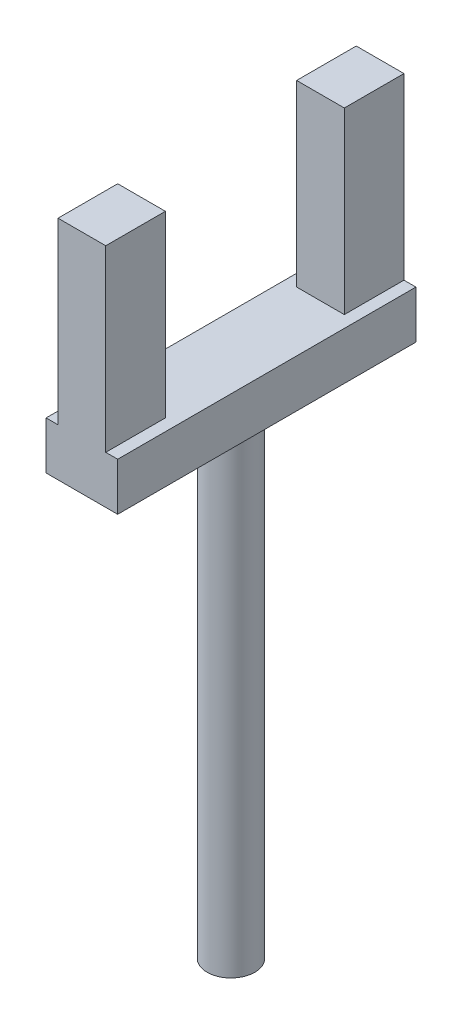
ISO-10303-21;
HEADER;
FILE_DESCRIPTION(('STEP AP214'),'2;1');
FILE_NAME('part.step','',(''),(''),'','','');
FILE_SCHEMA(('AUTOMOTIVE_DESIGN { 1 0 10303 214 1 1 1 1 }'));
ENDSEC;
DATA;
#1=APPLICATION_CONTEXT('core data for automotive mechanical design processes');
#2=APPLICATION_PROTOCOL_DEFINITION('international standard','automotive_design',2000,#1);
#3=PRODUCT_CONTEXT('',#1,'mechanical');
#4=PRODUCT('Part','Part','',(#3));
#5=PRODUCT_RELATED_PRODUCT_CATEGORY('part','',(#4));
#6=PRODUCT_DEFINITION_FORMATION('','',#4);
#7=PRODUCT_DEFINITION_CONTEXT('part definition',#1,'design');
#8=PRODUCT_DEFINITION('design','',#6,#7);
#9=PRODUCT_DEFINITION_SHAPE('','',#8);
#10=(LENGTH_UNIT() NAMED_UNIT(*) SI_UNIT(.MILLI.,.METRE.));
#11=(NAMED_UNIT(*) PLANE_ANGLE_UNIT() SI_UNIT($,.RADIAN.));
#12=(NAMED_UNIT(*) SI_UNIT($,.STERADIAN.) SOLID_ANGLE_UNIT());
#13=UNCERTAINTY_MEASURE_WITH_UNIT(LENGTH_MEASURE(1.E-05),#10,'distance_accuracy_value','');
#14=(GEOMETRIC_REPRESENTATION_CONTEXT(3) GLOBAL_UNCERTAINTY_ASSIGNED_CONTEXT((#13)) GLOBAL_UNIT_ASSIGNED_CONTEXT((#10,
#11,#12)) REPRESENTATION_CONTEXT('',''));
#15=CARTESIAN_POINT('',(0.,0.,0.));
#16=DIRECTION('',(0.,0.,1.));
#17=DIRECTION('',(1.,0.,0.));
#18=AXIS2_PLACEMENT_3D('',#15,#16,#17);
#19=CARTESIAN_POINT('',(-15.,220.,62.5));
#20=DIRECTION('',(0.,1.,0.));
#21=DIRECTION('',(0.,0.,1.));
#22=AXIS2_PLACEMENT_3D('',#19,#20,#21);
#23=PLANE('',#22);
#24=DIRECTION('',(1.,0.,0.));
#25=VECTOR('',#24,1.);
#26=CARTESIAN_POINT('',(-10.,220.,-37.5));
#27=LINE('',#26,#25);
#28=CARTESIAN_POINT('',(-10.,220.,-37.5));
#29=VERTEX_POINT('',#28);
#30=CARTESIAN_POINT('',(10.,220.,-37.5));
#31=VERTEX_POINT('',#30);
#32=EDGE_CURVE('E52',#29,#31,#27,.T.);
#33=ORIENTED_EDGE('',*,*,#32,.F.);
#34=DIRECTION('',(0.,0.,-1.));
#35=VECTOR('',#34,1.);
#36=CARTESIAN_POINT('',(-10.,220.,-62.5));
#37=LINE('',#36,#35);
#38=CARTESIAN_POINT('',(-10.,220.,-62.5));
#39=VERTEX_POINT('',#38);
#40=EDGE_CURVE('E142',#29,#39,#37,.T.);
#41=ORIENTED_EDGE('',*,*,#40,.T.);
#42=DIRECTION('',(1.,0.,0.));
#43=VECTOR('',#42,1.);
#44=CARTESIAN_POINT('',(-15.,220.,-62.5));
#45=LINE('',#44,#43);
#46=CARTESIAN_POINT('',(-15.,220.,-62.5));
#47=VERTEX_POINT('',#46);
#48=EDGE_CURVE('E219',#47,#39,#45,.T.);
#49=ORIENTED_EDGE('',*,*,#48,.F.);
#50=DIRECTION('',(0.,0.,1.));
#51=VECTOR('',#50,1.);
#52=CARTESIAN_POINT('',(-15.,220.,62.5));
#53=LINE('',#52,#51);
#54=CARTESIAN_POINT('',(-15.,220.,62.5));
#55=VERTEX_POINT('',#54);
#56=EDGE_CURVE('E201',#47,#55,#53,.T.);
#57=ORIENTED_EDGE('',*,*,#56,.T.);
#58=DIRECTION('',(1.,0.,0.));
#59=VECTOR('',#58,1.);
#60=CARTESIAN_POINT('',(-15.,220.,62.5));
#61=LINE('',#60,#59);
#62=CARTESIAN_POINT('',(-10.,220.,62.5));
#63=VERTEX_POINT('',#62);
#64=EDGE_CURVE('E215',#55,#63,#61,.T.);
#65=ORIENTED_EDGE('',*,*,#64,.T.);
#66=DIRECTION('',(0.,0.,-1.));
#67=VECTOR('',#66,1.);
#68=CARTESIAN_POINT('',(-10.,220.,62.5));
#69=LINE('',#68,#67);
#70=CARTESIAN_POINT('',(-10.,220.,37.5));
#71=VERTEX_POINT('',#70);
#72=EDGE_CURVE('E170',#63,#71,#69,.T.);
#73=ORIENTED_EDGE('',*,*,#72,.T.);
#74=DIRECTION('',(1.,0.,0.));
#75=VECTOR('',#74,1.);
#76=CARTESIAN_POINT('',(-10.,220.,37.5));
#77=LINE('',#76,#75);
#78=CARTESIAN_POINT('',(10.,220.,37.5));
#79=VERTEX_POINT('',#78);
#80=EDGE_CURVE('E179',#71,#79,#77,.T.);
#81=ORIENTED_EDGE('',*,*,#80,.T.);
#82=DIRECTION('',(0.,0.,-1.));
#83=VECTOR('',#82,1.);
#84=CARTESIAN_POINT('',(10.,220.,62.5));
#85=LINE('',#84,#83);
#86=CARTESIAN_POINT('',(10.,220.,62.5));
#87=VERTEX_POINT('',#86);
#88=EDGE_CURVE('E159',#87,#79,#85,.T.);
#89=ORIENTED_EDGE('',*,*,#88,.F.);
#90=CARTESIAN_POINT('',(15.,220.,62.5));
#91=VERTEX_POINT('',#90);
#92=EDGE_CURVE('E218',#87,#91,#61,.T.);
#93=ORIENTED_EDGE('',*,*,#92,.T.);
#94=DIRECTION('',(0.,0.,1.));
#95=VECTOR('',#94,1.);
#96=CARTESIAN_POINT('',(15.,220.,62.5));
#97=LINE('',#96,#95);
#98=CARTESIAN_POINT('',(15.,220.,-62.5));
#99=VERTEX_POINT('',#98);
#100=EDGE_CURVE('E189',#99,#91,#97,.T.);
#101=ORIENTED_EDGE('',*,*,#100,.F.);
#102=CARTESIAN_POINT('',(10.,220.,-62.5));
#103=VERTEX_POINT('',#102);
#104=EDGE_CURVE('E210',#103,#99,#45,.T.);
#105=ORIENTED_EDGE('',*,*,#104,.F.);
#106=DIRECTION('',(0.,0.,-1.));
#107=VECTOR('',#106,1.);
#108=CARTESIAN_POINT('',(10.,220.,-62.5));
#109=LINE('',#108,#107);
#110=EDGE_CURVE('E57',#31,#103,#109,.T.);
#111=ORIENTED_EDGE('',*,*,#110,.F.);
#112=EDGE_LOOP('',(#33,#41,#49,#57,#65,#73,#81,#89,#93,#101,#105,#111));
#113=FACE_BOUND('',#112,.T.);
#114=ADVANCED_FACE('F37',(#113),#23,.T.);
#115=CARTESIAN_POINT('',(0.,200.,0.));
#116=DIRECTION('',(0.,-1.,0.));
#117=DIRECTION('',(0.,0.,-1.));
#118=AXIS2_PLACEMENT_3D('',#115,#116,#117);
#119=CYLINDRICAL_SURFACE('',#118,10.);
#120=CARTESIAN_POINT('',(0.,200.,0.));
#121=DIRECTION('',(0.,1.,0.));
#122=DIRECTION('',(0.,0.,1.));
#123=AXIS2_PLACEMENT_3D('',#120,#121,#122);
#124=CIRCLE('',#123,10.);
#125=CARTESIAN_POINT('',(0.,200.,10.));
#126=VERTEX_POINT('',#125);
#127=EDGE_CURVE('E11',#126,#126,#124,.T.);
#128=ORIENTED_EDGE('',*,*,#127,.F.);
#129=EDGE_LOOP('',(#128));
#130=FACE_BOUND('',#129,.T.);
#131=CARTESIAN_POINT('',(0.,0.,0.));
#132=DIRECTION('',(0.,1.,0.));
#133=DIRECTION('',(0.,0.,1.));
#134=AXIS2_PLACEMENT_3D('',#131,#132,#133);
#135=CIRCLE('',#134,10.);
#136=CARTESIAN_POINT('',(0.,0.,10.));
#137=VERTEX_POINT('',#136);
#138=EDGE_CURVE('E41',#137,#137,#135,.T.);
#139=ORIENTED_EDGE('',*,*,#138,.T.);
#140=EDGE_LOOP('',(#139));
#141=FACE_BOUND('',#140,.T.);
#142=ADVANCED_FACE('F39',(#130,#141),#119,.T.);
#143=CARTESIAN_POINT('',(0.,0.,0.));
#144=DIRECTION('',(0.,1.,0.));
#145=DIRECTION('',(0.,0.,1.));
#146=AXIS2_PLACEMENT_3D('',#143,#144,#145);
#147=PLANE('',#146);
#148=ORIENTED_EDGE('',*,*,#138,.F.);
#149=EDGE_LOOP('',(#148));
#150=FACE_BOUND('',#149,.T.);
#151=ADVANCED_FACE('F256',(#150),#147,.F.);
#152=CARTESIAN_POINT('',(-15.,220.,-62.5));
#153=DIRECTION('',(0.,0.,-1.));
#154=DIRECTION('',(0.,1.,0.));
#155=AXIS2_PLACEMENT_3D('',#152,#153,#154);
#156=PLANE('',#155);
#157=ORIENTED_EDGE('',*,*,#48,.T.);
#158=DIRECTION('',(0.,1.,0.));
#159=VECTOR('',#158,1.);
#160=CARTESIAN_POINT('',(-10.,220.,-62.5));
#161=LINE('',#160,#159);
#162=CARTESIAN_POINT('',(-10.,295.,-62.5));
#163=VERTEX_POINT('',#162);
#164=EDGE_CURVE('E145',#39,#163,#161,.T.);
#165=ORIENTED_EDGE('',*,*,#164,.T.);
#166=DIRECTION('',(1.,0.,0.));
#167=VECTOR('',#166,1.);
#168=CARTESIAN_POINT('',(-10.,295.,-62.5));
#169=LINE('',#168,#167);
#170=CARTESIAN_POINT('',(10.,295.,-62.5));
#171=VERTEX_POINT('',#170);
#172=EDGE_CURVE('E134',#163,#171,#169,.T.);
#173=ORIENTED_EDGE('',*,*,#172,.T.);
#174=DIRECTION('',(0.,1.,0.));
#175=VECTOR('',#174,1.);
#176=CARTESIAN_POINT('',(10.,220.,-62.5));
#177=LINE('',#176,#175);
#178=EDGE_CURVE('E154',#103,#171,#177,.T.);
#179=ORIENTED_EDGE('',*,*,#178,.F.);
#180=ORIENTED_EDGE('',*,*,#104,.T.);
#181=DIRECTION('',(0.,1.,0.));
#182=VECTOR('',#181,1.);
#183=CARTESIAN_POINT('',(15.,220.,-62.5));
#184=LINE('',#183,#182);
#185=CARTESIAN_POINT('',(15.,200.,-62.5));
#186=VERTEX_POINT('',#185);
#187=EDGE_CURVE('E182',#186,#99,#184,.T.);
#188=ORIENTED_EDGE('',*,*,#187,.F.);
#189=DIRECTION('',(1.,0.,0.));
#190=VECTOR('',#189,1.);
#191=CARTESIAN_POINT('',(-15.,200.,-62.5));
#192=LINE('',#191,#190);
#193=CARTESIAN_POINT('',(-15.,200.,-62.5));
#194=VERTEX_POINT('',#193);
#195=EDGE_CURVE('E211',#194,#186,#192,.T.);
#196=ORIENTED_EDGE('',*,*,#195,.F.);
#197=DIRECTION('',(0.,1.,0.));
#198=VECTOR('',#197,1.);
#199=CARTESIAN_POINT('',(-15.,220.,-62.5));
#200=LINE('',#199,#198);
#201=EDGE_CURVE('E198',#194,#47,#200,.T.);
#202=ORIENTED_EDGE('',*,*,#201,.T.);
#203=EDGE_LOOP('',(#157,#165,#173,#179,#180,#188,#196,#202));
#204=FACE_BOUND('',#203,.T.);
#205=ADVANCED_FACE('F225',(#204),#156,.T.);
#206=CARTESIAN_POINT('',(-15.,200.,62.5));
#207=DIRECTION('',(0.,-1.,0.));
#208=DIRECTION('',(0.,0.,-1.));
#209=AXIS2_PLACEMENT_3D('',#206,#207,#208);
#210=PLANE('',#209);
#211=ORIENTED_EDGE('',*,*,#127,.T.);
#212=EDGE_LOOP('',(#211));
#213=FACE_BOUND('',#212,.T.);
#214=ORIENTED_EDGE('',*,*,#195,.T.);
#215=DIRECTION('',(0.,0.,-1.));
#216=VECTOR('',#215,1.);
#217=CARTESIAN_POINT('',(15.,200.,62.5));
#218=LINE('',#217,#216);
#219=CARTESIAN_POINT('',(15.,200.,62.5));
#220=VERTEX_POINT('',#219);
#221=EDGE_CURVE('E195',#220,#186,#218,.T.);
#222=ORIENTED_EDGE('',*,*,#221,.F.);
#223=DIRECTION('',(1.,0.,0.));
#224=VECTOR('',#223,1.);
#225=CARTESIAN_POINT('',(-15.,200.,62.5));
#226=LINE('',#225,#224);
#227=CARTESIAN_POINT('',(-15.,200.,62.5));
#228=VERTEX_POINT('',#227);
#229=EDGE_CURVE('E213',#228,#220,#226,.T.);
#230=ORIENTED_EDGE('',*,*,#229,.F.);
#231=DIRECTION('',(0.,0.,-1.));
#232=VECTOR('',#231,1.);
#233=CARTESIAN_POINT('',(-15.,200.,62.5));
#234=LINE('',#233,#232);
#235=EDGE_CURVE('E207',#228,#194,#234,.T.);
#236=ORIENTED_EDGE('',*,*,#235,.T.);
#237=EDGE_LOOP('',(#214,#222,#230,#236));
#238=FACE_BOUND('',#237,.T.);
#239=ADVANCED_FACE('F233',(#213,#238),#210,.T.);
#240=CARTESIAN_POINT('',(-15.,220.,62.5));
#241=DIRECTION('',(0.,0.,1.));
#242=DIRECTION('',(1.,0.,0.));
#243=AXIS2_PLACEMENT_3D('',#240,#241,#242);
#244=PLANE('',#243);
#245=ORIENTED_EDGE('',*,*,#229,.T.);
#246=DIRECTION('',(0.,-1.,0.));
#247=VECTOR('',#246,1.);
#248=CARTESIAN_POINT('',(15.,220.,62.5));
#249=LINE('',#248,#247);
#250=EDGE_CURVE('E192',#91,#220,#249,.T.);
#251=ORIENTED_EDGE('',*,*,#250,.F.);
#252=ORIENTED_EDGE('',*,*,#92,.F.);
#253=DIRECTION('',(0.,-1.,0.));
#254=VECTOR('',#253,1.);
#255=CARTESIAN_POINT('',(10.,220.,62.5));
#256=LINE('',#255,#254);
#257=CARTESIAN_POINT('',(10.,295.,62.5));
#258=VERTEX_POINT('',#257);
#259=EDGE_CURVE('E157',#258,#87,#256,.T.);
#260=ORIENTED_EDGE('',*,*,#259,.F.);
#261=DIRECTION('',(1.,0.,0.));
#262=VECTOR('',#261,1.);
#263=CARTESIAN_POINT('',(-10.,295.,62.5));
#264=LINE('',#263,#262);
#265=CARTESIAN_POINT('',(-10.,295.,62.5));
#266=VERTEX_POINT('',#265);
#267=EDGE_CURVE('E180',#266,#258,#264,.T.);
#268=ORIENTED_EDGE('',*,*,#267,.F.);
#269=DIRECTION('',(0.,-1.,0.));
#270=VECTOR('',#269,1.);
#271=CARTESIAN_POINT('',(-10.,220.,62.5));
#272=LINE('',#271,#270);
#273=EDGE_CURVE('E167',#266,#63,#272,.T.);
#274=ORIENTED_EDGE('',*,*,#273,.T.);
#275=ORIENTED_EDGE('',*,*,#64,.F.);
#276=DIRECTION('',(0.,-1.,0.));
#277=VECTOR('',#276,1.);
#278=CARTESIAN_POINT('',(-15.,220.,62.5));
#279=LINE('',#278,#277);
#280=EDGE_CURVE('E204',#55,#228,#279,.T.);
#281=ORIENTED_EDGE('',*,*,#280,.T.);
#282=EDGE_LOOP('',(#245,#251,#252,#260,#268,#274,#275,#281));
#283=FACE_BOUND('',#282,.T.);
#284=ADVANCED_FACE('F260',(#283),#244,.T.);
#285=CARTESIAN_POINT('',(-15.,0.,0.));
#286=DIRECTION('',(1.,0.,0.));
#287=DIRECTION('',(0.,0.,-1.));
#288=AXIS2_PLACEMENT_3D('',#285,#286,#287);
#289=PLANE('',#288);
#290=ORIENTED_EDGE('',*,*,#201,.F.);
#291=ORIENTED_EDGE('',*,*,#235,.F.);
#292=ORIENTED_EDGE('',*,*,#280,.F.);
#293=ORIENTED_EDGE('',*,*,#56,.F.);
#294=EDGE_LOOP('',(#290,#291,#292,#293));
#295=FACE_BOUND('',#294,.T.);
#296=ADVANCED_FACE('F238',(#295),#289,.F.);
#297=CARTESIAN_POINT('',(15.,0.,0.));
#298=DIRECTION('',(1.,0.,0.));
#299=DIRECTION('',(0.,0.,-1.));
#300=AXIS2_PLACEMENT_3D('',#297,#298,#299);
#301=PLANE('',#300);
#302=ORIENTED_EDGE('',*,*,#187,.T.);
#303=ORIENTED_EDGE('',*,*,#100,.T.);
#304=ORIENTED_EDGE('',*,*,#250,.T.);
#305=ORIENTED_EDGE('',*,*,#221,.T.);
#306=EDGE_LOOP('',(#302,#303,#304,#305));
#307=FACE_BOUND('',#306,.T.);
#308=ADVANCED_FACE('F230',(#307),#301,.T.);
#309=CARTESIAN_POINT('',(-10.,295.,62.5));
#310=DIRECTION('',(0.,1.,0.));
#311=DIRECTION('',(0.,0.,1.));
#312=AXIS2_PLACEMENT_3D('',#309,#310,#311);
#313=PLANE('',#312);
#314=ORIENTED_EDGE('',*,*,#267,.T.);
#315=DIRECTION('',(0.,0.,1.));
#316=VECTOR('',#315,1.);
#317=CARTESIAN_POINT('',(10.,295.,62.5));
#318=LINE('',#317,#316);
#319=CARTESIAN_POINT('',(10.,295.,37.5));
#320=VERTEX_POINT('',#319);
#321=EDGE_CURVE('E164',#320,#258,#318,.T.);
#322=ORIENTED_EDGE('',*,*,#321,.F.);
#323=DIRECTION('',(1.,0.,0.));
#324=VECTOR('',#323,1.);
#325=CARTESIAN_POINT('',(-10.,295.,37.5));
#326=LINE('',#325,#324);
#327=CARTESIAN_POINT('',(-10.,295.,37.5));
#328=VERTEX_POINT('',#327);
#329=EDGE_CURVE('E183',#328,#320,#326,.T.);
#330=ORIENTED_EDGE('',*,*,#329,.F.);
#331=DIRECTION('',(0.,0.,1.));
#332=VECTOR('',#331,1.);
#333=CARTESIAN_POINT('',(-10.,295.,62.5));
#334=LINE('',#333,#332);
#335=EDGE_CURVE('E176',#328,#266,#334,.T.);
#336=ORIENTED_EDGE('',*,*,#335,.T.);
#337=EDGE_LOOP('',(#314,#322,#330,#336));
#338=FACE_BOUND('',#337,.T.);
#339=ADVANCED_FACE('F301',(#338),#313,.T.);
#340=CARTESIAN_POINT('',(-10.,220.,37.5));
#341=DIRECTION('',(0.,0.,-1.));
#342=DIRECTION('',(-1.,0.,0.));
#343=AXIS2_PLACEMENT_3D('',#340,#341,#342);
#344=PLANE('',#343);
#345=ORIENTED_EDGE('',*,*,#329,.T.);
#346=DIRECTION('',(0.,1.,0.));
#347=VECTOR('',#346,1.);
#348=CARTESIAN_POINT('',(10.,220.,37.5));
#349=LINE('',#348,#347);
#350=EDGE_CURVE('E161',#79,#320,#349,.T.);
#351=ORIENTED_EDGE('',*,*,#350,.F.);
#352=ORIENTED_EDGE('',*,*,#80,.F.);
#353=DIRECTION('',(0.,1.,0.));
#354=VECTOR('',#353,1.);
#355=CARTESIAN_POINT('',(-10.,220.,37.5));
#356=LINE('',#355,#354);
#357=EDGE_CURVE('E173',#71,#328,#356,.T.);
#358=ORIENTED_EDGE('',*,*,#357,.T.);
#359=EDGE_LOOP('',(#345,#351,#352,#358));
#360=FACE_BOUND('',#359,.T.);
#361=ADVANCED_FACE('F307',(#360),#344,.T.);
#362=CARTESIAN_POINT('',(-10.,0.,0.));
#363=DIRECTION('',(-1.,0.,0.));
#364=DIRECTION('',(0.,0.,1.));
#365=AXIS2_PLACEMENT_3D('',#362,#363,#364);
#366=PLANE('',#365);
#367=ORIENTED_EDGE('',*,*,#273,.F.);
#368=ORIENTED_EDGE('',*,*,#335,.F.);
#369=ORIENTED_EDGE('',*,*,#357,.F.);
#370=ORIENTED_EDGE('',*,*,#72,.F.);
#371=EDGE_LOOP('',(#367,#368,#369,#370));
#372=FACE_BOUND('',#371,.T.);
#373=ADVANCED_FACE('F315',(#372),#366,.T.);
#374=CARTESIAN_POINT('',(10.,0.,0.));
#375=DIRECTION('',(-1.,0.,0.));
#376=DIRECTION('',(0.,0.,1.));
#377=AXIS2_PLACEMENT_3D('',#374,#375,#376);
#378=PLANE('',#377);
#379=ORIENTED_EDGE('',*,*,#259,.T.);
#380=ORIENTED_EDGE('',*,*,#88,.T.);
#381=ORIENTED_EDGE('',*,*,#350,.T.);
#382=ORIENTED_EDGE('',*,*,#321,.T.);
#383=EDGE_LOOP('',(#379,#380,#381,#382));
#384=FACE_BOUND('',#383,.T.);
#385=ADVANCED_FACE('F323',(#384),#378,.F.);
#386=CARTESIAN_POINT('',(-10.,220.,-37.5));
#387=DIRECTION('',(0.,0.,1.));
#388=DIRECTION('',(1.,0.,0.));
#389=AXIS2_PLACEMENT_3D('',#386,#387,#388);
#390=PLANE('',#389);
#391=ORIENTED_EDGE('',*,*,#32,.T.);
#392=DIRECTION('',(0.,-1.,0.));
#393=VECTOR('',#392,1.);
#394=CARTESIAN_POINT('',(10.,220.,-37.5));
#395=LINE('',#394,#393);
#396=CARTESIAN_POINT('',(10.,295.,-37.5));
#397=VERTEX_POINT('',#396);
#398=EDGE_CURVE('E129',#397,#31,#395,.T.);
#399=ORIENTED_EDGE('',*,*,#398,.F.);
#400=DIRECTION('',(1.,0.,0.));
#401=VECTOR('',#400,1.);
#402=CARTESIAN_POINT('',(-10.,295.,-37.5));
#403=LINE('',#402,#401);
#404=CARTESIAN_POINT('',(-10.,295.,-37.5));
#405=VERTEX_POINT('',#404);
#406=EDGE_CURVE('E123',#405,#397,#403,.T.);
#407=ORIENTED_EDGE('',*,*,#406,.F.);
#408=DIRECTION('',(0.,-1.,0.));
#409=VECTOR('',#408,1.);
#410=CARTESIAN_POINT('',(-10.,220.,-37.5));
#411=LINE('',#410,#409);
#412=EDGE_CURVE('E126',#405,#29,#411,.T.);
#413=ORIENTED_EDGE('',*,*,#412,.T.);
#414=EDGE_LOOP('',(#391,#399,#407,#413));
#415=FACE_BOUND('',#414,.T.);
#416=ADVANCED_FACE('F125',(#415),#390,.T.);
#417=CARTESIAN_POINT('',(-10.,295.,-62.5));
#418=DIRECTION('',(0.,1.,0.));
#419=DIRECTION('',(0.,0.,1.));
#420=AXIS2_PLACEMENT_3D('',#417,#418,#419);
#421=PLANE('',#420);
#422=ORIENTED_EDGE('',*,*,#406,.T.);
#423=DIRECTION('',(0.,0.,1.));
#424=VECTOR('',#423,1.);
#425=CARTESIAN_POINT('',(10.,295.,-62.5));
#426=LINE('',#425,#424);
#427=EDGE_CURVE('E152',#171,#397,#426,.T.);
#428=ORIENTED_EDGE('',*,*,#427,.F.);
#429=ORIENTED_EDGE('',*,*,#172,.F.);
#430=DIRECTION('',(0.,0.,1.));
#431=VECTOR('',#430,1.);
#432=CARTESIAN_POINT('',(-10.,295.,-62.5));
#433=LINE('',#432,#431);
#434=EDGE_CURVE('E140',#163,#405,#433,.T.);
#435=ORIENTED_EDGE('',*,*,#434,.T.);
#436=EDGE_LOOP('',(#422,#428,#429,#435));
#437=FACE_BOUND('',#436,.T.);
#438=ADVANCED_FACE('F144',(#437),#421,.T.);
#439=CARTESIAN_POINT('',(-10.,0.,0.));
#440=DIRECTION('',(1.,0.,0.));
#441=DIRECTION('',(0.,0.,-1.));
#442=AXIS2_PLACEMENT_3D('',#439,#440,#441);
#443=PLANE('',#442);
#444=ORIENTED_EDGE('',*,*,#164,.F.);
#445=ORIENTED_EDGE('',*,*,#40,.F.);
#446=ORIENTED_EDGE('',*,*,#412,.F.);
#447=ORIENTED_EDGE('',*,*,#434,.F.);
#448=EDGE_LOOP('',(#444,#445,#446,#447));
#449=FACE_BOUND('',#448,.T.);
#450=ADVANCED_FACE('F139',(#449),#443,.F.);
#451=CARTESIAN_POINT('',(10.,0.,0.));
#452=DIRECTION('',(1.,0.,0.));
#453=DIRECTION('',(0.,0.,-1.));
#454=AXIS2_PLACEMENT_3D('',#451,#452,#453);
#455=PLANE('',#454);
#456=ORIENTED_EDGE('',*,*,#178,.T.);
#457=ORIENTED_EDGE('',*,*,#427,.T.);
#458=ORIENTED_EDGE('',*,*,#398,.T.);
#459=ORIENTED_EDGE('',*,*,#110,.T.);
#460=EDGE_LOOP('',(#456,#457,#458,#459));
#461=FACE_BOUND('',#460,.T.);
#462=ADVANCED_FACE('F243',(#461),#455,.T.);
#463=CLOSED_SHELL('',(#114,#142,#151,#205,#239,#284,#296,#308,#339,#361,#373,#385,#416,#438,
#450,#462));
#464=MANIFOLD_SOLID_BREP('B2',#463);
#465=ADVANCED_BREP_SHAPE_REPRESENTATION('',(#18,#464),#14);
#466=SHAPE_DEFINITION_REPRESENTATION(#9,#465);
ENDSEC;
END-ISO-10303-21;
